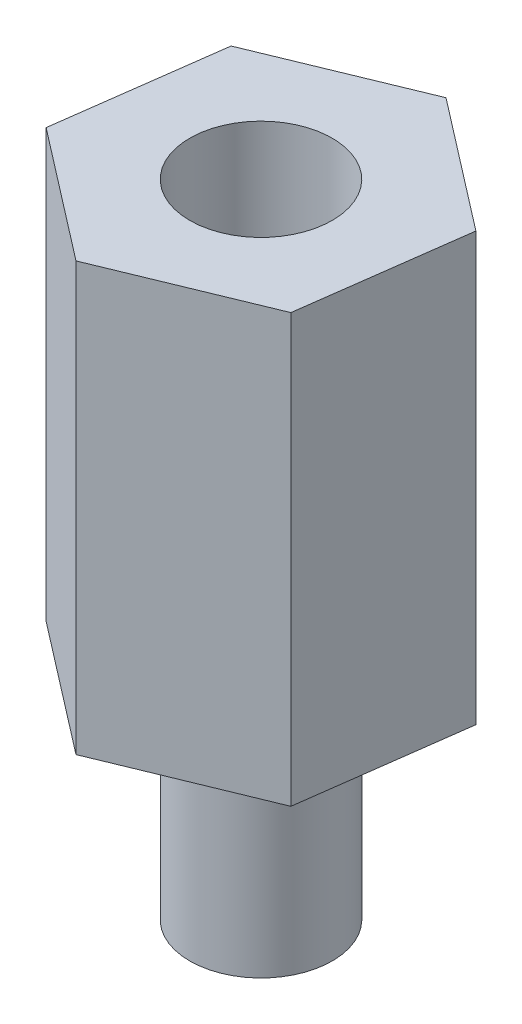
ISO-10303-21;
HEADER;
FILE_DESCRIPTION(('STEP AP214'),'2;1');
FILE_NAME('part.step','',(''),(''),'','','');
FILE_SCHEMA(('AUTOMOTIVE_DESIGN { 1 0 10303 214 1 1 1 1 }'));
ENDSEC;
DATA;
#1=APPLICATION_CONTEXT('core data for automotive mechanical design processes');
#2=APPLICATION_PROTOCOL_DEFINITION('international standard','automotive_design',2000,#1);
#3=PRODUCT_CONTEXT('',#1,'mechanical');
#4=PRODUCT('Part','Part','',(#3));
#5=PRODUCT_RELATED_PRODUCT_CATEGORY('part','',(#4));
#6=PRODUCT_DEFINITION_FORMATION('','',#4);
#7=PRODUCT_DEFINITION_CONTEXT('part definition',#1,'design');
#8=PRODUCT_DEFINITION('design','',#6,#7);
#9=PRODUCT_DEFINITION_SHAPE('','',#8);
#10=(LENGTH_UNIT() NAMED_UNIT(*) SI_UNIT(.MILLI.,.METRE.));
#11=(NAMED_UNIT(*) PLANE_ANGLE_UNIT() SI_UNIT($,.RADIAN.));
#12=(NAMED_UNIT(*) SI_UNIT($,.STERADIAN.) SOLID_ANGLE_UNIT());
#13=UNCERTAINTY_MEASURE_WITH_UNIT(LENGTH_MEASURE(1.E-05),#10,'distance_accuracy_value','');
#14=(GEOMETRIC_REPRESENTATION_CONTEXT(3) GLOBAL_UNCERTAINTY_ASSIGNED_CONTEXT((#13)) GLOBAL_UNIT_ASSIGNED_CONTEXT((#10,
#11,#12)) REPRESENTATION_CONTEXT('',''));
#15=CARTESIAN_POINT('',(0.,0.,0.));
#16=DIRECTION('',(0.,0.,1.));
#17=DIRECTION('',(1.,0.,0.));
#18=AXIS2_PLACEMENT_3D('',#15,#16,#17);
#19=CARTESIAN_POINT('',(0.,3.,0.));
#20=DIRECTION('',(0.,-1.,0.));
#21=DIRECTION('',(0.,0.,-1.));
#22=AXIS2_PLACEMENT_3D('',#19,#20,#21);
#23=CYLINDRICAL_SURFACE('',#22,1.);
#24=CARTESIAN_POINT('',(0.,3.,0.));
#25=DIRECTION('',(0.,1.,0.));
#26=DIRECTION('',(0.,0.,1.));
#27=AXIS2_PLACEMENT_3D('',#24,#25,#26);
#28=CIRCLE('',#27,1.);
#29=CARTESIAN_POINT('',(0.,3.,1.));
#30=VERTEX_POINT('',#29);
#31=EDGE_CURVE('E11',#30,#30,#28,.T.);
#32=ORIENTED_EDGE('',*,*,#31,.F.);
#33=EDGE_LOOP('',(#32));
#34=FACE_BOUND('',#33,.T.);
#35=CARTESIAN_POINT('',(0.,0.,0.));
#36=DIRECTION('',(0.,1.,0.));
#37=DIRECTION('',(0.,0.,1.));
#38=AXIS2_PLACEMENT_3D('',#35,#36,#37);
#39=CIRCLE('',#38,1.);
#40=CARTESIAN_POINT('',(0.,0.,1.));
#41=VERTEX_POINT('',#40);
#42=EDGE_CURVE('E38',#41,#41,#39,.T.);
#43=ORIENTED_EDGE('',*,*,#42,.T.);
#44=EDGE_LOOP('',(#43));
#45=FACE_BOUND('',#44,.T.);
#46=ADVANCED_FACE('F35',(#34,#45),#23,.T.);
#47=CARTESIAN_POINT('',(0.,0.,0.));
#48=DIRECTION('',(0.,1.,0.));
#49=DIRECTION('',(0.,0.,1.));
#50=AXIS2_PLACEMENT_3D('',#47,#48,#49);
#51=PLANE('',#50);
#52=ORIENTED_EDGE('',*,*,#42,.F.);
#53=EDGE_LOOP('',(#52));
#54=FACE_BOUND('',#53,.T.);
#55=ADVANCED_FACE('F144',(#54),#51,.F.);
#56=CARTESIAN_POINT('',(0.306435830659067,9.,-2.28958447795407));
#57=DIRECTION('',(0.380697413418403,0.,0.92469966984775));
#58=DIRECTION('',(0.92469966984775,0.,-0.380697413418403));
#59=AXIS2_PLACEMENT_3D('',#56,#57,#58);
#60=PLANE('',#59);
#61=DIRECTION('',(-0.92469966984775,0.,0.380697413418403));
#62=VECTOR('',#61,1.);
#63=CARTESIAN_POINT('',(0.306435830659067,3.,-2.28958447795407));
#64=LINE('',#63,#62);
#65=CARTESIAN_POINT('',(0.306435830659067,3.,-2.28958447795407));
#66=VERTEX_POINT('',#65);
#67=CARTESIAN_POINT('',(-1.82962040668923,3.,-1.41017345295756));
#68=VERTEX_POINT('',#67);
#69=EDGE_CURVE('E120',#66,#68,#64,.T.);
#70=ORIENTED_EDGE('',*,*,#69,.T.);
#71=DIRECTION('',(0.,-1.,0.));
#72=VECTOR('',#71,1.);
#73=CARTESIAN_POINT('',(-1.82962040668923,9.,-1.41017345295756));
#74=LINE('',#73,#72);
#75=CARTESIAN_POINT('',(-1.82962040668923,9.,-1.41017345295756));
#76=VERTEX_POINT('',#75);
#77=EDGE_CURVE('E138',#76,#68,#74,.T.);
#78=ORIENTED_EDGE('',*,*,#77,.F.);
#79=DIRECTION('',(-0.92469966984775,0.,0.380697413418403));
#80=VECTOR('',#79,1.);
#81=CARTESIAN_POINT('',(0.306435830659067,9.,-2.28958447795407));
#82=LINE('',#81,#80);
#83=CARTESIAN_POINT('',(0.306435830659067,9.,-2.28958447795407));
#84=VERTEX_POINT('',#83);
#85=EDGE_CURVE('E131',#84,#76,#82,.T.);
#86=ORIENTED_EDGE('',*,*,#85,.F.);
#87=DIRECTION('',(0.,-1.,0.));
#88=VECTOR('',#87,1.);
#89=CARTESIAN_POINT('',(0.306435830659067,9.,-2.28958447795407));
#90=LINE('',#89,#88);
#91=EDGE_CURVE('E116',#84,#66,#90,.T.);
#92=ORIENTED_EDGE('',*,*,#91,.T.);
#93=EDGE_LOOP('',(#70,#78,#86,#92));
#94=FACE_BOUND('',#93,.T.);
#95=ADVANCED_FACE('F146',(#94),#60,.F.);
#96=CARTESIAN_POINT('',(-1.82962040668923,9.,-1.41017345295756));
#97=DIRECTION('',(0.991162111668434,0.,0.132656203748528));
#98=DIRECTION('',(0.132656203748528,0.,-0.991162111668434));
#99=AXIS2_PLACEMENT_3D('',#96,#97,#98);
#100=PLANE('',#99);
#101=DIRECTION('',(-0.132656203748528,0.,0.991162111668434));
#102=VECTOR('',#101,1.);
#103=CARTESIAN_POINT('',(-1.82962040668923,3.,-1.41017345295756));
#104=LINE('',#103,#102);
#105=CARTESIAN_POINT('',(-2.13605623734833,3.,0.879411024996525));
#106=VERTEX_POINT('',#105);
#107=EDGE_CURVE('E123',#68,#106,#104,.T.);
#108=ORIENTED_EDGE('',*,*,#107,.T.);
#109=DIRECTION('',(0.,-1.,0.));
#110=VECTOR('',#109,1.);
#111=CARTESIAN_POINT('',(-2.13605623734833,9.,0.879411024996525));
#112=LINE('',#111,#110);
#113=CARTESIAN_POINT('',(-2.13605623734833,9.,0.879411024996525));
#114=VERTEX_POINT('',#113);
#115=EDGE_CURVE('E135',#114,#106,#112,.T.);
#116=ORIENTED_EDGE('',*,*,#115,.F.);
#117=DIRECTION('',(-0.132656203748528,0.,0.991162111668434));
#118=VECTOR('',#117,1.);
#119=CARTESIAN_POINT('',(-1.82962040668923,9.,-1.41017345295756));
#120=LINE('',#119,#118);
#121=EDGE_CURVE('E89',#76,#114,#120,.T.);
#122=ORIENTED_EDGE('',*,*,#121,.F.);
#123=ORIENTED_EDGE('',*,*,#77,.T.);
#124=EDGE_LOOP('',(#108,#116,#122,#123));
#125=FACE_BOUND('',#124,.T.);
#126=ADVANCED_FACE('F151',(#125),#100,.F.);
#127=CARTESIAN_POINT('',(-2.13605623734833,9.,0.879411024996525));
#128=DIRECTION('',(0.610464698250019,0.,-0.79204346609925));
#129=DIRECTION('',(-0.79204346609925,0.,-0.610464698250019));
#130=AXIS2_PLACEMENT_3D('',#127,#128,#129);
#131=PLANE('',#130);
#132=DIRECTION('',(0.79204346609925,0.,0.610464698250019));
#133=VECTOR('',#132,1.);
#134=CARTESIAN_POINT('',(-2.13605623734833,3.,0.879411024996525));
#135=LINE('',#134,#133);
#136=CARTESIAN_POINT('',(-0.306435830659067,3.,2.28958447795407));
#137=VERTEX_POINT('',#136);
#138=EDGE_CURVE('E126',#106,#137,#135,.T.);
#139=ORIENTED_EDGE('',*,*,#138,.T.);
#140=DIRECTION('',(0.,-1.,0.));
#141=VECTOR('',#140,1.);
#142=CARTESIAN_POINT('',(-0.306435830659067,9.,2.28958447795407));
#143=LINE('',#142,#141);
#144=CARTESIAN_POINT('',(-0.306435830659067,9.,2.28958447795407));
#145=VERTEX_POINT('',#144);
#146=EDGE_CURVE('E111',#145,#137,#143,.T.);
#147=ORIENTED_EDGE('',*,*,#146,.F.);
#148=DIRECTION('',(0.79204346609925,0.,0.610464698250019));
#149=VECTOR('',#148,1.);
#150=CARTESIAN_POINT('',(-2.13605623734833,9.,0.879411024996525));
#151=LINE('',#150,#149);
#152=EDGE_CURVE('E102',#114,#145,#151,.T.);
#153=ORIENTED_EDGE('',*,*,#152,.F.);
#154=ORIENTED_EDGE('',*,*,#115,.T.);
#155=EDGE_LOOP('',(#139,#147,#153,#154));
#156=FACE_BOUND('',#155,.T.);
#157=ADVANCED_FACE('F158',(#156),#131,.F.);
#158=CARTESIAN_POINT('',(-0.306435830659067,9.,2.28958447795407));
#159=DIRECTION('',(-0.380697413418403,0.,-0.92469966984775));
#160=DIRECTION('',(-0.92469966984775,0.,0.380697413418404));
#161=AXIS2_PLACEMENT_3D('',#158,#159,#160);
#162=PLANE('',#161);
#163=DIRECTION('',(0.92469966984775,0.,-0.380697413418403));
#164=VECTOR('',#163,1.);
#165=CARTESIAN_POINT('',(-0.306435830659067,3.,2.28958447795407));
#166=LINE('',#165,#164);
#167=CARTESIAN_POINT('',(1.82962040668923,3.,1.41017345295756));
#168=VERTEX_POINT('',#167);
#169=EDGE_CURVE('E110',#137,#168,#166,.T.);
#170=ORIENTED_EDGE('',*,*,#169,.T.);
#171=DIRECTION('',(0.,-1.,0.));
#172=VECTOR('',#171,1.);
#173=CARTESIAN_POINT('',(1.82962040668923,9.,1.41017345295756));
#174=LINE('',#173,#172);
#175=CARTESIAN_POINT('',(1.82962040668923,9.,1.41017345295756));
#176=VERTEX_POINT('',#175);
#177=EDGE_CURVE('E107',#176,#168,#174,.T.);
#178=ORIENTED_EDGE('',*,*,#177,.F.);
#179=DIRECTION('',(0.92469966984775,0.,-0.380697413418403));
#180=VECTOR('',#179,1.);
#181=CARTESIAN_POINT('',(-0.306435830659067,9.,2.28958447795407));
#182=LINE('',#181,#180);
#183=EDGE_CURVE('E96',#145,#176,#182,.T.);
#184=ORIENTED_EDGE('',*,*,#183,.F.);
#185=ORIENTED_EDGE('',*,*,#146,.T.);
#186=EDGE_LOOP('',(#170,#178,#184,#185));
#187=FACE_BOUND('',#186,.T.);
#188=ADVANCED_FACE('F108',(#187),#162,.F.);
#189=CARTESIAN_POINT('',(1.82962040668923,9.,1.41017345295756));
#190=DIRECTION('',(-0.991162111668434,0.,-0.132656203748528));
#191=DIRECTION('',(-0.132656203748528,0.,0.991162111668434));
#192=AXIS2_PLACEMENT_3D('',#189,#190,#191);
#193=PLANE('',#192);
#194=DIRECTION('',(0.132656203748528,0.,-0.991162111668434));
#195=VECTOR('',#194,1.);
#196=CARTESIAN_POINT('',(1.82962040668923,3.,1.41017345295756));
#197=LINE('',#196,#195);
#198=CARTESIAN_POINT('',(2.13605623734833,3.,-0.879411024996525));
#199=VERTEX_POINT('',#198);
#200=EDGE_CURVE('E74',#168,#199,#197,.T.);
#201=ORIENTED_EDGE('',*,*,#200,.T.);
#202=DIRECTION('',(0.,-1.,0.));
#203=VECTOR('',#202,1.);
#204=CARTESIAN_POINT('',(2.13605623734833,9.,-0.879411024996525));
#205=LINE('',#204,#203);
#206=CARTESIAN_POINT('',(2.13605623734833,9.,-0.879411024996525));
#207=VERTEX_POINT('',#206);
#208=EDGE_CURVE('E112',#207,#199,#205,.T.);
#209=ORIENTED_EDGE('',*,*,#208,.F.);
#210=DIRECTION('',(0.132656203748528,0.,-0.991162111668434));
#211=VECTOR('',#210,1.);
#212=CARTESIAN_POINT('',(1.82962040668923,9.,1.41017345295756));
#213=LINE('',#212,#211);
#214=EDGE_CURVE('E100',#176,#207,#213,.T.);
#215=ORIENTED_EDGE('',*,*,#214,.F.);
#216=ORIENTED_EDGE('',*,*,#177,.T.);
#217=EDGE_LOOP('',(#201,#209,#215,#216));
#218=FACE_BOUND('',#217,.T.);
#219=ADVANCED_FACE('F114',(#218),#193,.F.);
#220=CARTESIAN_POINT('',(2.13605623734833,9.,-0.879411024996525));
#221=DIRECTION('',(-0.610464698250019,0.,0.79204346609925));
#222=DIRECTION('',(0.79204346609925,0.,0.610464698250019));
#223=AXIS2_PLACEMENT_3D('',#220,#221,#222);
#224=PLANE('',#223);
#225=DIRECTION('',(-0.79204346609925,0.,-0.610464698250019));
#226=VECTOR('',#225,1.);
#227=CARTESIAN_POINT('',(2.13605623734833,3.,-0.879411024996525));
#228=LINE('',#227,#226);
#229=EDGE_CURVE('E80',#199,#66,#228,.T.);
#230=ORIENTED_EDGE('',*,*,#229,.T.);
#231=ORIENTED_EDGE('',*,*,#91,.F.);
#232=DIRECTION('',(-0.79204346609925,0.,-0.610464698250019));
#233=VECTOR('',#232,1.);
#234=CARTESIAN_POINT('',(2.13605623734833,9.,-0.879411024996525));
#235=LINE('',#234,#233);
#236=EDGE_CURVE('E51',#207,#84,#235,.T.);
#237=ORIENTED_EDGE('',*,*,#236,.F.);
#238=ORIENTED_EDGE('',*,*,#208,.T.);
#239=EDGE_LOOP('',(#230,#231,#237,#238));
#240=FACE_BOUND('',#239,.T.);
#241=ADVANCED_FACE('F166',(#240),#224,.F.);
#242=CARTESIAN_POINT('',(0.,9.,0.));
#243=DIRECTION('',(0.,1.,0.));
#244=DIRECTION('',(0.,0.,1.));
#245=AXIS2_PLACEMENT_3D('',#242,#243,#244);
#246=PLANE('',#245);
#247=CARTESIAN_POINT('',(0.,9.,0.));
#248=DIRECTION('',(0.,1.,0.));
#249=DIRECTION('',(0.,0.,1.));
#250=AXIS2_PLACEMENT_3D('',#247,#248,#249);
#251=CIRCLE('',#250,1.);
#252=CARTESIAN_POINT('',(0.,9.,1.));
#253=VERTEX_POINT('',#252);
#254=EDGE_CURVE('E187',#253,#253,#251,.T.);
#255=ORIENTED_EDGE('',*,*,#254,.F.);
#256=EDGE_LOOP('',(#255));
#257=FACE_BOUND('',#256,.T.);
#258=ORIENTED_EDGE('',*,*,#85,.T.);
#259=ORIENTED_EDGE('',*,*,#121,.T.);
#260=ORIENTED_EDGE('',*,*,#152,.T.);
#261=ORIENTED_EDGE('',*,*,#183,.T.);
#262=ORIENTED_EDGE('',*,*,#214,.T.);
#263=ORIENTED_EDGE('',*,*,#236,.T.);
#264=EDGE_LOOP('',(#258,#259,#260,#261,#262,#263));
#265=FACE_BOUND('',#264,.T.);
#266=ADVANCED_FACE('F98',(#257,#265),#246,.T.);
#267=CARTESIAN_POINT('',(0.,3.,0.));
#268=DIRECTION('',(0.,1.,0.));
#269=DIRECTION('',(0.,0.,1.));
#270=AXIS2_PLACEMENT_3D('',#267,#268,#269);
#271=PLANE('',#270);
#272=ORIENTED_EDGE('',*,*,#31,.T.);
#273=EDGE_LOOP('',(#272));
#274=FACE_BOUND('',#273,.T.);
#275=ORIENTED_EDGE('',*,*,#69,.F.);
#276=ORIENTED_EDGE('',*,*,#229,.F.);
#277=ORIENTED_EDGE('',*,*,#200,.F.);
#278=ORIENTED_EDGE('',*,*,#169,.F.);
#279=ORIENTED_EDGE('',*,*,#138,.F.);
#280=ORIENTED_EDGE('',*,*,#107,.F.);
#281=EDGE_LOOP('',(#275,#276,#277,#278,#279,#280));
#282=FACE_BOUND('',#281,.T.);
#283=ADVANCED_FACE('F169',(#274,#282),#271,.F.);
#284=CARTESIAN_POINT('',(0.,4.,0.));
#285=DIRECTION('',(0.,1.,0.));
#286=DIRECTION('',(0.,0.,1.));
#287=AXIS2_PLACEMENT_3D('',#284,#285,#286);
#288=CYLINDRICAL_SURFACE('',#287,1.);
#289=CARTESIAN_POINT('',(0.,4.,0.));
#290=DIRECTION('',(0.,1.,0.));
#291=DIRECTION('',(0.,0.,1.));
#292=AXIS2_PLACEMENT_3D('',#289,#290,#291);
#293=CIRCLE('',#292,1.);
#294=CARTESIAN_POINT('',(0.,4.,1.));
#295=VERTEX_POINT('',#294);
#296=EDGE_CURVE('E124',#295,#295,#293,.T.);
#297=ORIENTED_EDGE('',*,*,#296,.F.);
#298=EDGE_LOOP('',(#297));
#299=FACE_BOUND('',#298,.T.);
#300=ORIENTED_EDGE('',*,*,#254,.T.);
#301=EDGE_LOOP('',(#300));
#302=FACE_BOUND('',#301,.T.);
#303=ADVANCED_FACE('F172',(#299,#302),#288,.F.);
#304=CARTESIAN_POINT('',(0.,4.,0.));
#305=DIRECTION('',(0.,1.,0.));
#306=DIRECTION('',(0.,0.,1.));
#307=AXIS2_PLACEMENT_3D('',#304,#305,#306);
#308=PLANE('',#307);
#309=ORIENTED_EDGE('',*,*,#296,.T.);
#310=EDGE_LOOP('',(#309));
#311=FACE_BOUND('',#310,.T.);
#312=ADVANCED_FACE('F179',(#311),#308,.T.);
#313=CLOSED_SHELL('',(#46,#55,#95,#126,#157,#188,#219,#241,#266,#283,#303,#312));
#314=MANIFOLD_SOLID_BREP('B2',#313);
#315=ADVANCED_BREP_SHAPE_REPRESENTATION('',(#18,#314),#14);
#316=SHAPE_DEFINITION_REPRESENTATION(#9,#315);
ENDSEC;
END-ISO-10303-21;
